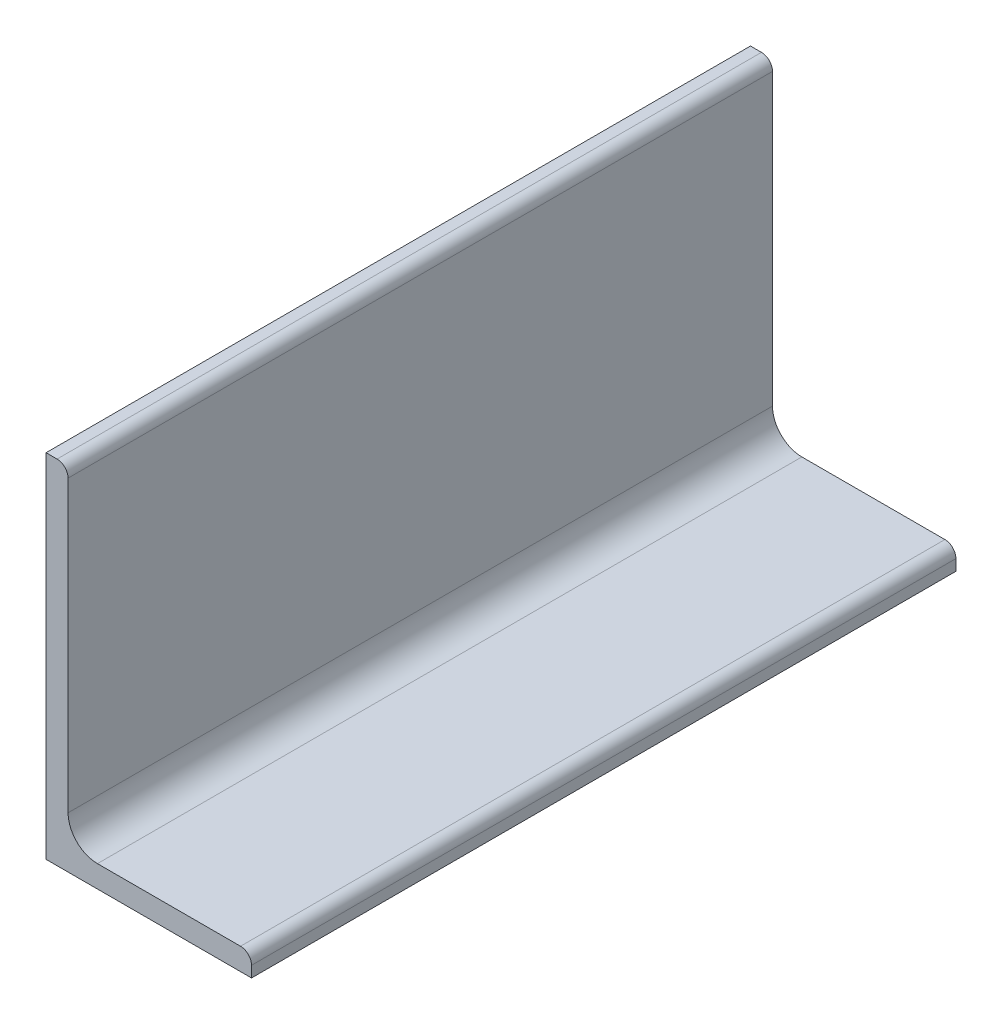
ISO-10303-21;
HEADER;
FILE_DESCRIPTION(('STEP AP214'),'2;1');
FILE_NAME('part.step','',(''),(''),'','','');
FILE_SCHEMA(('AUTOMOTIVE_DESIGN { 1 0 10303 214 1 1 1 1 }'));
ENDSEC;
DATA;
#1=APPLICATION_CONTEXT('core data for automotive mechanical design processes');
#2=APPLICATION_PROTOCOL_DEFINITION('international standard','automotive_design',2000,#1);
#3=PRODUCT_CONTEXT('',#1,'mechanical');
#4=PRODUCT('Part','Part','',(#3));
#5=PRODUCT_RELATED_PRODUCT_CATEGORY('part','',(#4));
#6=PRODUCT_DEFINITION_FORMATION('','',#4);
#7=PRODUCT_DEFINITION_CONTEXT('part definition',#1,'design');
#8=PRODUCT_DEFINITION('design','',#6,#7);
#9=PRODUCT_DEFINITION_SHAPE('','',#8);
#10=(LENGTH_UNIT() NAMED_UNIT(*) SI_UNIT(.MILLI.,.METRE.));
#11=(NAMED_UNIT(*) PLANE_ANGLE_UNIT() SI_UNIT($,.RADIAN.));
#12=(NAMED_UNIT(*) SI_UNIT($,.STERADIAN.) SOLID_ANGLE_UNIT());
#13=UNCERTAINTY_MEASURE_WITH_UNIT(LENGTH_MEASURE(1.E-05),#10,'distance_accuracy_value','');
#14=(GEOMETRIC_REPRESENTATION_CONTEXT(3) GLOBAL_UNCERTAINTY_ASSIGNED_CONTEXT((#13)) GLOBAL_UNIT_ASSIGNED_CONTEXT((#10,
#11,#12)) REPRESENTATION_CONTEXT('',''));
#15=CARTESIAN_POINT('',(0.,0.,0.));
#16=DIRECTION('',(0.,0.,1.));
#17=DIRECTION('',(1.,0.,0.));
#18=AXIS2_PLACEMENT_3D('',#15,#16,#17);
#19=CARTESIAN_POINT('',(0.0836264027816469,152.925428131371,304.8));
#20=DIRECTION('',(1.,0.,0.));
#21=DIRECTION('',(0.,0.,-1.));
#22=AXIS2_PLACEMENT_3D('',#19,#20,#21);
#23=PLANE('',#22);
#24=DIRECTION('',(0.,-1.,0.));
#25=VECTOR('',#24,1.);
#26=CARTESIAN_POINT('',(0.0836264027816469,152.925428131371,0.));
#27=LINE('',#26,#25);
#28=CARTESIAN_POINT('',(0.0836264027816469,152.925428131371,0.));
#29=VERTEX_POINT('',#28);
#30=CARTESIAN_POINT('',(0.0836264027816469,0.525428131371291,0.));
#31=VERTEX_POINT('',#30);
#32=EDGE_CURVE('E135',#29,#31,#27,.T.);
#33=ORIENTED_EDGE('',*,*,#32,.T.);
#34=DIRECTION('',(0.,0.,-1.));
#35=VECTOR('',#34,1.);
#36=CARTESIAN_POINT('',(0.0836264027816469,0.525428131371291,304.8));
#37=LINE('',#36,#35);
#38=CARTESIAN_POINT('',(0.0836264027816469,0.525428131371291,304.8));
#39=VERTEX_POINT('',#38);
#40=EDGE_CURVE('E11',#39,#31,#37,.T.);
#41=ORIENTED_EDGE('',*,*,#40,.F.);
#42=DIRECTION('',(0.,-1.,0.));
#43=VECTOR('',#42,1.);
#44=CARTESIAN_POINT('',(0.0836264027816469,152.925428131371,304.8));
#45=LINE('',#44,#43);
#46=CARTESIAN_POINT('',(0.0836264027816469,152.925428131371,304.8));
#47=VERTEX_POINT('',#46);
#48=EDGE_CURVE('E151',#47,#39,#45,.T.);
#49=ORIENTED_EDGE('',*,*,#48,.F.);
#50=DIRECTION('',(0.,0.,-1.));
#51=VECTOR('',#50,1.);
#52=CARTESIAN_POINT('',(0.0836264027816469,152.925428131371,304.8));
#53=LINE('',#52,#51);
#54=EDGE_CURVE('E131',#47,#29,#53,.T.);
#55=ORIENTED_EDGE('',*,*,#54,.T.);
#56=EDGE_LOOP('',(#33,#41,#49,#55));
#57=FACE_BOUND('',#56,.T.);
#58=ADVANCED_FACE('F33',(#57),#23,.F.);
#59=CARTESIAN_POINT('',(0.0836264027816469,0.525428131371291,304.8));
#60=DIRECTION('',(0.,1.,0.));
#61=DIRECTION('',(0.,0.,1.));
#62=AXIS2_PLACEMENT_3D('',#59,#60,#61);
#63=PLANE('',#62);
#64=DIRECTION('',(1.,0.,0.));
#65=VECTOR('',#64,1.);
#66=CARTESIAN_POINT('',(0.0836264027816469,0.525428131371291,0.));
#67=LINE('',#66,#65);
#68=CARTESIAN_POINT('',(88.9836264027817,0.525428131371291,0.));
#69=VERTEX_POINT('',#68);
#70=EDGE_CURVE('E138',#31,#69,#67,.T.);
#71=ORIENTED_EDGE('',*,*,#70,.T.);
#72=DIRECTION('',(0.,0.,-1.));
#73=VECTOR('',#72,1.);
#74=CARTESIAN_POINT('',(88.9836264027817,0.525428131371291,304.8));
#75=LINE('',#74,#73);
#76=CARTESIAN_POINT('',(88.9836264027817,0.525428131371291,304.8));
#77=VERTEX_POINT('',#76);
#78=EDGE_CURVE('E41',#77,#69,#75,.T.);
#79=ORIENTED_EDGE('',*,*,#78,.F.);
#80=DIRECTION('',(1.,0.,0.));
#81=VECTOR('',#80,1.);
#82=CARTESIAN_POINT('',(0.0836264027816469,0.525428131371291,304.8));
#83=LINE('',#82,#81);
#84=EDGE_CURVE('E95',#39,#77,#83,.T.);
#85=ORIENTED_EDGE('',*,*,#84,.F.);
#86=ORIENTED_EDGE('',*,*,#40,.T.);
#87=EDGE_LOOP('',(#71,#79,#85,#86));
#88=FACE_BOUND('',#87,.T.);
#89=ADVANCED_FACE('F194',(#88),#63,.F.);
#90=CARTESIAN_POINT('',(88.9836264027817,0.525428131371291,304.8));
#91=DIRECTION('',(-1.,0.,0.));
#92=DIRECTION('',(0.,0.,1.));
#93=AXIS2_PLACEMENT_3D('',#90,#91,#92);
#94=PLANE('',#93);
#95=DIRECTION('',(0.,1.,0.));
#96=VECTOR('',#95,1.);
#97=CARTESIAN_POINT('',(88.9836264027817,0.525428131371291,0.));
#98=LINE('',#97,#96);
#99=CARTESIAN_POINT('',(88.9836264027817,5.28792813137129,0.));
#100=VERTEX_POINT('',#99);
#101=EDGE_CURVE('E140',#69,#100,#98,.T.);
#102=ORIENTED_EDGE('',*,*,#101,.T.);
#103=DIRECTION('',(0.,0.,-1.));
#104=VECTOR('',#103,1.);
#105=CARTESIAN_POINT('',(88.9836264027817,5.28792813137129,304.8));
#106=LINE('',#105,#104);
#107=CARTESIAN_POINT('',(88.9836264027817,5.28792813137129,304.8));
#108=VERTEX_POINT('',#107);
#109=EDGE_CURVE('E161',#108,#100,#106,.T.);
#110=ORIENTED_EDGE('',*,*,#109,.F.);
#111=DIRECTION('',(0.,1.,0.));
#112=VECTOR('',#111,1.);
#113=CARTESIAN_POINT('',(88.9836264027817,0.525428131371291,304.8));
#114=LINE('',#113,#112);
#115=EDGE_CURVE('E169',#77,#108,#114,.T.);
#116=ORIENTED_EDGE('',*,*,#115,.F.);
#117=ORIENTED_EDGE('',*,*,#78,.T.);
#118=EDGE_LOOP('',(#102,#110,#116,#117));
#119=FACE_BOUND('',#118,.T.);
#120=ADVANCED_FACE('F167',(#119),#94,.F.);
#121=CARTESIAN_POINT('',(84.2211264027816,5.28792813137129,304.8));
#122=DIRECTION('',(0.,0.,-1.));
#123=DIRECTION('',(-1.,0.,0.));
#124=AXIS2_PLACEMENT_3D('',#121,#122,#123);
#125=CYLINDRICAL_SURFACE('',#124,4.7625);
#126=CARTESIAN_POINT('',(84.2211264027816,5.28792813137129,0.));
#127=DIRECTION('',(0.,0.,1.));
#128=DIRECTION('',(1.,0.,0.));
#129=AXIS2_PLACEMENT_3D('',#126,#127,#128);
#130=CIRCLE('',#129,4.7625);
#131=CARTESIAN_POINT('',(84.2211264027816,10.0504281313713,0.));
#132=VERTEX_POINT('',#131);
#133=EDGE_CURVE('E142',#100,#132,#130,.T.);
#134=ORIENTED_EDGE('',*,*,#133,.T.);
#135=DIRECTION('',(0.,0.,-1.));
#136=VECTOR('',#135,1.);
#137=CARTESIAN_POINT('',(84.2211264027816,10.0504281313713,304.8));
#138=LINE('',#137,#136);
#139=CARTESIAN_POINT('',(84.2211264027816,10.0504281313713,304.8));
#140=VERTEX_POINT('',#139);
#141=EDGE_CURVE('E158',#140,#132,#138,.T.);
#142=ORIENTED_EDGE('',*,*,#141,.F.);
#143=CARTESIAN_POINT('',(84.2211264027816,5.28792813137129,304.8));
#144=DIRECTION('',(0.,0.,1.));
#145=DIRECTION('',(1.,0.,0.));
#146=AXIS2_PLACEMENT_3D('',#143,#144,#145);
#147=CIRCLE('',#146,4.7625);
#148=EDGE_CURVE('E185',#108,#140,#147,.T.);
#149=ORIENTED_EDGE('',*,*,#148,.F.);
#150=ORIENTED_EDGE('',*,*,#109,.T.);
#151=EDGE_LOOP('',(#134,#142,#149,#150));
#152=FACE_BOUND('',#151,.T.);
#153=ADVANCED_FACE('F178',(#152),#125,.T.);
#154=CARTESIAN_POINT('',(84.2211264027816,10.0504281313713,304.8));
#155=DIRECTION('',(0.,-1.,0.));
#156=DIRECTION('',(0.,0.,-1.));
#157=AXIS2_PLACEMENT_3D('',#154,#155,#156);
#158=PLANE('',#157);
#159=DIRECTION('',(-1.,0.,0.));
#160=VECTOR('',#159,1.);
#161=CARTESIAN_POINT('',(84.2211264027816,10.0504281313713,0.));
#162=LINE('',#161,#160);
#163=CARTESIAN_POINT('',(22.3086264027816,10.0504281313713,0.));
#164=VERTEX_POINT('',#163);
#165=EDGE_CURVE('E144',#132,#164,#162,.T.);
#166=ORIENTED_EDGE('',*,*,#165,.T.);
#167=DIRECTION('',(0.,0.,-1.));
#168=VECTOR('',#167,1.);
#169=CARTESIAN_POINT('',(22.3086264027816,10.0504281313713,304.8));
#170=LINE('',#169,#168);
#171=CARTESIAN_POINT('',(22.3086264027816,10.0504281313713,304.8));
#172=VERTEX_POINT('',#171);
#173=EDGE_CURVE('E155',#172,#164,#170,.T.);
#174=ORIENTED_EDGE('',*,*,#173,.F.);
#175=DIRECTION('',(-1.,0.,0.));
#176=VECTOR('',#175,1.);
#177=CARTESIAN_POINT('',(84.2211264027816,10.0504281313713,304.8));
#178=LINE('',#177,#176);
#179=EDGE_CURVE('E184',#140,#172,#178,.T.);
#180=ORIENTED_EDGE('',*,*,#179,.F.);
#181=ORIENTED_EDGE('',*,*,#141,.T.);
#182=EDGE_LOOP('',(#166,#174,#180,#181));
#183=FACE_BOUND('',#182,.T.);
#184=ADVANCED_FACE('F182',(#183),#158,.F.);
#185=CARTESIAN_POINT('',(22.3086264027816,22.7504281313713,304.8));
#186=DIRECTION('',(0.,0.,-1.));
#187=DIRECTION('',(-1.,0.,0.));
#188=AXIS2_PLACEMENT_3D('',#185,#186,#187);
#189=CYLINDRICAL_SURFACE('',#188,12.7);
#190=CARTESIAN_POINT('',(22.3086264027816,22.7504281313713,0.));
#191=DIRECTION('',(0.,0.,-1.));
#192=DIRECTION('',(1.,0.,0.));
#193=AXIS2_PLACEMENT_3D('',#190,#191,#192);
#194=CIRCLE('',#193,12.7);
#195=CARTESIAN_POINT('',(9.60862640278165,22.7504281313713,0.));
#196=VERTEX_POINT('',#195);
#197=EDGE_CURVE('E146',#164,#196,#194,.T.);
#198=ORIENTED_EDGE('',*,*,#197,.T.);
#199=DIRECTION('',(0.,0.,-1.));
#200=VECTOR('',#199,1.);
#201=CARTESIAN_POINT('',(9.60862640278165,22.7504281313713,304.8));
#202=LINE('',#201,#200);
#203=CARTESIAN_POINT('',(9.60862640278165,22.7504281313713,304.8));
#204=VERTEX_POINT('',#203);
#205=EDGE_CURVE('E126',#204,#196,#202,.T.);
#206=ORIENTED_EDGE('',*,*,#205,.F.);
#207=CARTESIAN_POINT('',(22.3086264027816,22.7504281313713,304.8));
#208=DIRECTION('',(0.,0.,-1.));
#209=DIRECTION('',(1.,0.,0.));
#210=AXIS2_PLACEMENT_3D('',#207,#208,#209);
#211=CIRCLE('',#210,12.7);
#212=EDGE_CURVE('E117',#172,#204,#211,.T.);
#213=ORIENTED_EDGE('',*,*,#212,.F.);
#214=ORIENTED_EDGE('',*,*,#173,.T.);
#215=EDGE_LOOP('',(#198,#206,#213,#214));
#216=FACE_BOUND('',#215,.T.);
#217=ADVANCED_FACE('F206',(#216),#189,.F.);
#218=CARTESIAN_POINT('',(9.60862640278165,22.7504281313713,304.8));
#219=DIRECTION('',(-1.,0.,0.));
#220=DIRECTION('',(0.,0.,1.));
#221=AXIS2_PLACEMENT_3D('',#218,#219,#220);
#222=PLANE('',#221);
#223=DIRECTION('',(0.,1.,0.));
#224=VECTOR('',#223,1.);
#225=CARTESIAN_POINT('',(9.60862640278165,22.7504281313713,0.));
#226=LINE('',#225,#224);
#227=CARTESIAN_POINT('',(9.60862640278165,148.162928131371,0.));
#228=VERTEX_POINT('',#227);
#229=EDGE_CURVE('E125',#196,#228,#226,.T.);
#230=ORIENTED_EDGE('',*,*,#229,.T.);
#231=DIRECTION('',(0.,0.,-1.));
#232=VECTOR('',#231,1.);
#233=CARTESIAN_POINT('',(9.60862640278165,148.162928131371,304.8));
#234=LINE('',#233,#232);
#235=CARTESIAN_POINT('',(9.60862640278165,148.162928131371,304.8));
#236=VERTEX_POINT('',#235);
#237=EDGE_CURVE('E122',#236,#228,#234,.T.);
#238=ORIENTED_EDGE('',*,*,#237,.F.);
#239=DIRECTION('',(0.,1.,0.));
#240=VECTOR('',#239,1.);
#241=CARTESIAN_POINT('',(9.60862640278165,22.7504281313713,304.8));
#242=LINE('',#241,#240);
#243=EDGE_CURVE('E111',#204,#236,#242,.T.);
#244=ORIENTED_EDGE('',*,*,#243,.F.);
#245=ORIENTED_EDGE('',*,*,#205,.T.);
#246=EDGE_LOOP('',(#230,#238,#244,#245));
#247=FACE_BOUND('',#246,.T.);
#248=ADVANCED_FACE('F123',(#247),#222,.F.);
#249=CARTESIAN_POINT('',(4.84612640278165,148.162928131371,304.8));
#250=DIRECTION('',(0.,0.,-1.));
#251=DIRECTION('',(-1.,0.,0.));
#252=AXIS2_PLACEMENT_3D('',#249,#250,#251);
#253=CYLINDRICAL_SURFACE('',#252,4.7625);
#254=CARTESIAN_POINT('',(4.84612640278165,148.162928131371,0.));
#255=DIRECTION('',(0.,0.,1.));
#256=DIRECTION('',(1.,0.,0.));
#257=AXIS2_PLACEMENT_3D('',#254,#255,#256);
#258=CIRCLE('',#257,4.7625);
#259=CARTESIAN_POINT('',(4.84612640278165,152.925428131371,0.));
#260=VERTEX_POINT('',#259);
#261=EDGE_CURVE('E81',#228,#260,#258,.T.);
#262=ORIENTED_EDGE('',*,*,#261,.T.);
#263=DIRECTION('',(0.,0.,-1.));
#264=VECTOR('',#263,1.);
#265=CARTESIAN_POINT('',(4.84612640278165,152.925428131371,304.8));
#266=LINE('',#265,#264);
#267=CARTESIAN_POINT('',(4.84612640278165,152.925428131371,304.8));
#268=VERTEX_POINT('',#267);
#269=EDGE_CURVE('E127',#268,#260,#266,.T.);
#270=ORIENTED_EDGE('',*,*,#269,.F.);
#271=CARTESIAN_POINT('',(4.84612640278165,148.162928131371,304.8));
#272=DIRECTION('',(0.,0.,1.));
#273=DIRECTION('',(1.,0.,0.));
#274=AXIS2_PLACEMENT_3D('',#271,#272,#273);
#275=CIRCLE('',#274,4.7625);
#276=EDGE_CURVE('E115',#236,#268,#275,.T.);
#277=ORIENTED_EDGE('',*,*,#276,.F.);
#278=ORIENTED_EDGE('',*,*,#237,.T.);
#279=EDGE_LOOP('',(#262,#270,#277,#278));
#280=FACE_BOUND('',#279,.T.);
#281=ADVANCED_FACE('F129',(#280),#253,.T.);
#282=CARTESIAN_POINT('',(4.84612640278165,152.925428131371,304.8));
#283=DIRECTION('',(0.,-1.,0.));
#284=DIRECTION('',(0.,0.,-1.));
#285=AXIS2_PLACEMENT_3D('',#282,#283,#284);
#286=PLANE('',#285);
#287=DIRECTION('',(-1.,0.,0.));
#288=VECTOR('',#287,1.);
#289=CARTESIAN_POINT('',(4.84612640278165,152.925428131371,0.));
#290=LINE('',#289,#288);
#291=EDGE_CURVE('E87',#260,#29,#290,.T.);
#292=ORIENTED_EDGE('',*,*,#291,.T.);
#293=ORIENTED_EDGE('',*,*,#54,.F.);
#294=DIRECTION('',(-1.,0.,0.));
#295=VECTOR('',#294,1.);
#296=CARTESIAN_POINT('',(4.84612640278165,152.925428131371,304.8));
#297=LINE('',#296,#295);
#298=EDGE_CURVE('E49',#268,#47,#297,.T.);
#299=ORIENTED_EDGE('',*,*,#298,.F.);
#300=ORIENTED_EDGE('',*,*,#269,.T.);
#301=EDGE_LOOP('',(#292,#293,#299,#300));
#302=FACE_BOUND('',#301,.T.);
#303=ADVANCED_FACE('F214',(#302),#286,.F.);
#304=CARTESIAN_POINT('',(84.2211264027816,5.28792813137129,304.8));
#305=DIRECTION('',(0.,0.,1.));
#306=DIRECTION('',(1.,0.,0.));
#307=AXIS2_PLACEMENT_3D('',#304,#305,#306);
#308=PLANE('',#307);
#309=ORIENTED_EDGE('',*,*,#48,.T.);
#310=ORIENTED_EDGE('',*,*,#84,.T.);
#311=ORIENTED_EDGE('',*,*,#115,.T.);
#312=ORIENTED_EDGE('',*,*,#148,.T.);
#313=ORIENTED_EDGE('',*,*,#179,.T.);
#314=ORIENTED_EDGE('',*,*,#212,.T.);
#315=ORIENTED_EDGE('',*,*,#243,.T.);
#316=ORIENTED_EDGE('',*,*,#276,.T.);
#317=ORIENTED_EDGE('',*,*,#298,.T.);
#318=EDGE_LOOP('',(#309,#310,#311,#312,#313,#314,#315,#316,#317));
#319=FACE_BOUND('',#318,.T.);
#320=ADVANCED_FACE('F113',(#319),#308,.T.);
#321=CARTESIAN_POINT('',(84.2211264027816,5.28792813137129,0.));
#322=DIRECTION('',(0.,0.,1.));
#323=DIRECTION('',(1.,0.,0.));
#324=AXIS2_PLACEMENT_3D('',#321,#322,#323);
#325=PLANE('',#324);
#326=ORIENTED_EDGE('',*,*,#32,.F.);
#327=ORIENTED_EDGE('',*,*,#291,.F.);
#328=ORIENTED_EDGE('',*,*,#261,.F.);
#329=ORIENTED_EDGE('',*,*,#229,.F.);
#330=ORIENTED_EDGE('',*,*,#197,.F.);
#331=ORIENTED_EDGE('',*,*,#165,.F.);
#332=ORIENTED_EDGE('',*,*,#133,.F.);
#333=ORIENTED_EDGE('',*,*,#101,.F.);
#334=ORIENTED_EDGE('',*,*,#70,.F.);
#335=EDGE_LOOP('',(#326,#327,#328,#329,#330,#331,#332,#333,#334));
#336=FACE_BOUND('',#335,.T.);
#337=ADVANCED_FACE('F173',(#336),#325,.F.);
#338=CLOSED_SHELL('',(#58,#89,#120,#153,#184,#217,#248,#281,#303,#320,#337));
#339=MANIFOLD_SOLID_BREP('B2',#338);
#340=ADVANCED_BREP_SHAPE_REPRESENTATION('',(#18,#339),#14);
#341=SHAPE_DEFINITION_REPRESENTATION(#9,#340);
ENDSEC;
END-ISO-10303-21;
